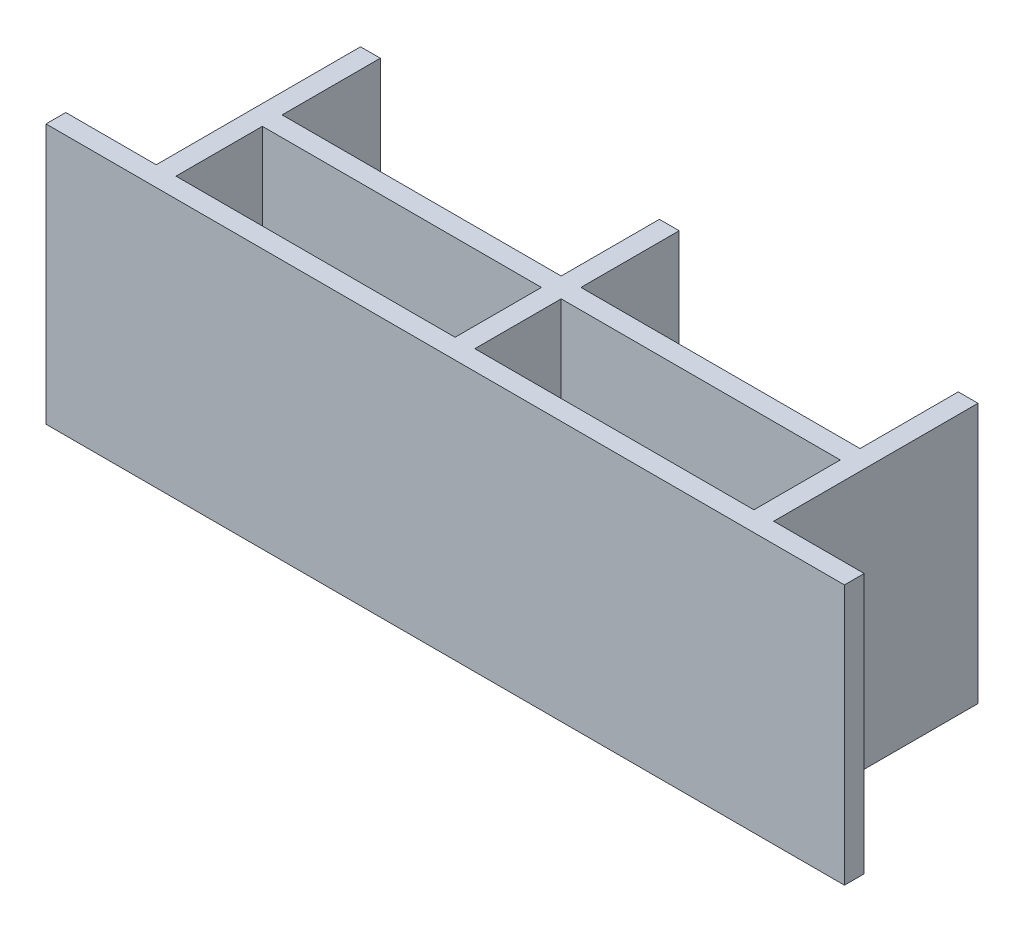
ISO-10303-21;
HEADER;
FILE_DESCRIPTION(('STEP AP214'),'2;1');
FILE_NAME('part.step','',(''),(''),'','','');
FILE_SCHEMA(('AUTOMOTIVE_DESIGN { 1 0 10303 214 1 1 1 1 }'));
ENDSEC;
DATA;
#1=APPLICATION_CONTEXT('core data for automotive mechanical design processes');
#2=APPLICATION_PROTOCOL_DEFINITION('international standard','automotive_design',2000,#1);
#3=PRODUCT_CONTEXT('',#1,'mechanical');
#4=PRODUCT('Part','Part','',(#3));
#5=PRODUCT_RELATED_PRODUCT_CATEGORY('part','',(#4));
#6=PRODUCT_DEFINITION_FORMATION('','',#4);
#7=PRODUCT_DEFINITION_CONTEXT('part definition',#1,'design');
#8=PRODUCT_DEFINITION('design','',#6,#7);
#9=PRODUCT_DEFINITION_SHAPE('','',#8);
#10=(LENGTH_UNIT() NAMED_UNIT(*) SI_UNIT(.MILLI.,.METRE.));
#11=(NAMED_UNIT(*) PLANE_ANGLE_UNIT() SI_UNIT($,.RADIAN.));
#12=(NAMED_UNIT(*) SI_UNIT($,.STERADIAN.) SOLID_ANGLE_UNIT());
#13=UNCERTAINTY_MEASURE_WITH_UNIT(LENGTH_MEASURE(1.E-05),#10,'distance_accuracy_value','');
#14=(GEOMETRIC_REPRESENTATION_CONTEXT(3) GLOBAL_UNCERTAINTY_ASSIGNED_CONTEXT((#13)) GLOBAL_UNIT_ASSIGNED_CONTEXT((#10,
#11,#12)) REPRESENTATION_CONTEXT('',''));
#15=CARTESIAN_POINT('',(0.,0.,0.));
#16=DIRECTION('',(0.,0.,1.));
#17=DIRECTION('',(1.,0.,0.));
#18=AXIS2_PLACEMENT_3D('',#15,#16,#17);
#19=CARTESIAN_POINT('',(0.,32.9,-43.));
#20=DIRECTION('',(0.,0.,1.));
#21=DIRECTION('',(1.,0.,0.));
#22=AXIS2_PLACEMENT_3D('',#19,#20,#21);
#23=PLANE('',#22);
#24=DIRECTION('',(-1.,0.,0.));
#25=VECTOR('',#24,1.);
#26=CARTESIAN_POINT('',(0.,32.9,-43.));
#27=LINE('',#26,#25);
#28=CARTESIAN_POINT('',(51.747,32.9,-43.));
#29=VERTEX_POINT('',#28);
#30=CARTESIAN_POINT('',(49.247,32.9,-43.));
#31=VERTEX_POINT('',#30);
#32=EDGE_CURVE('E42',#29,#31,#27,.T.);
#33=ORIENTED_EDGE('',*,*,#32,.F.);
#34=DIRECTION('',(0.,1.,0.));
#35=VECTOR('',#34,1.);
#36=CARTESIAN_POINT('',(51.747,0.,-43.));
#37=LINE('',#36,#35);
#38=CARTESIAN_POINT('',(51.747,0.,-43.));
#39=VERTEX_POINT('',#38);
#40=EDGE_CURVE('E283',#39,#29,#37,.T.);
#41=ORIENTED_EDGE('',*,*,#40,.F.);
#42=DIRECTION('',(-1.,0.,0.));
#43=VECTOR('',#42,1.);
#44=CARTESIAN_POINT('',(0.,0.,-43.));
#45=LINE('',#44,#43);
#46=CARTESIAN_POINT('',(49.247,0.,-43.));
#47=VERTEX_POINT('',#46);
#48=EDGE_CURVE('E378',#39,#47,#45,.T.);
#49=ORIENTED_EDGE('',*,*,#48,.T.);
#50=DIRECTION('',(0.,1.,0.));
#51=VECTOR('',#50,1.);
#52=CARTESIAN_POINT('',(49.247,0.,-43.));
#53=LINE('',#52,#51);
#54=EDGE_CURVE('E313',#47,#31,#53,.T.);
#55=ORIENTED_EDGE('',*,*,#54,.T.);
#56=EDGE_LOOP('',(#33,#41,#49,#55));
#57=FACE_BOUND('',#56,.T.);
#58=ADVANCED_FACE('F33',(#57),#23,.F.);
#59=CARTESIAN_POINT('',(13.945,32.9,-43.));
#60=VERTEX_POINT('',#59);
#61=CARTESIAN_POINT('',(11.445,32.9,-43.));
#62=VERTEX_POINT('',#61);
#63=EDGE_CURVE('E44',#60,#62,#27,.T.);
#64=ORIENTED_EDGE('',*,*,#63,.F.);
#65=DIRECTION('',(0.,1.,0.));
#66=VECTOR('',#65,1.);
#67=CARTESIAN_POINT('',(13.945,0.,-43.));
#68=LINE('',#67,#66);
#69=CARTESIAN_POINT('',(13.945,0.,-43.));
#70=VERTEX_POINT('',#69);
#71=EDGE_CURVE('E310',#70,#60,#68,.T.);
#72=ORIENTED_EDGE('',*,*,#71,.F.);
#73=CARTESIAN_POINT('',(11.445,0.,-43.));
#74=VERTEX_POINT('',#73);
#75=EDGE_CURVE('E374',#70,#74,#45,.T.);
#76=ORIENTED_EDGE('',*,*,#75,.T.);
#77=DIRECTION('',(0.,1.,0.));
#78=VECTOR('',#77,1.);
#79=CARTESIAN_POINT('',(11.445,0.,-43.));
#80=LINE('',#79,#78);
#81=EDGE_CURVE('E331',#74,#62,#80,.T.);
#82=ORIENTED_EDGE('',*,*,#81,.T.);
#83=EDGE_LOOP('',(#64,#72,#76,#82));
#84=FACE_BOUND('',#83,.T.);
#85=ADVANCED_FACE('F427',(#84),#23,.F.);
#86=CARTESIAN_POINT('',(0.,32.9,0.));
#87=DIRECTION('',(1.,0.,0.));
#88=DIRECTION('',(0.,0.,-1.));
#89=AXIS2_PLACEMENT_3D('',#86,#87,#88);
#90=PLANE('',#89);
#91=DIRECTION('',(0.,0.,1.));
#92=VECTOR('',#91,1.);
#93=CARTESIAN_POINT('',(0.,32.9,0.));
#94=LINE('',#93,#92);
#95=CARTESIAN_POINT('',(0.,32.9,-17.156));
#96=VERTEX_POINT('',#95);
#97=CARTESIAN_POINT('',(0.,32.9,-14.656));
#98=VERTEX_POINT('',#97);
#99=EDGE_CURVE('E367',#96,#98,#94,.T.);
#100=ORIENTED_EDGE('',*,*,#99,.F.);
#101=DIRECTION('',(0.,1.,0.));
#102=VECTOR('',#101,1.);
#103=CARTESIAN_POINT('',(0.,0.,-17.156));
#104=LINE('',#103,#102);
#105=CARTESIAN_POINT('',(0.,0.,-17.156));
#106=VERTEX_POINT('',#105);
#107=EDGE_CURVE('E326',#106,#96,#104,.T.);
#108=ORIENTED_EDGE('',*,*,#107,.F.);
#109=DIRECTION('',(0.,0.,1.));
#110=VECTOR('',#109,1.);
#111=CARTESIAN_POINT('',(0.,0.,0.));
#112=LINE('',#111,#110);
#113=CARTESIAN_POINT('',(0.,0.,-14.656));
#114=VERTEX_POINT('',#113);
#115=EDGE_CURVE('E365',#106,#114,#112,.T.);
#116=ORIENTED_EDGE('',*,*,#115,.T.);
#117=DIRECTION('',(0.,1.,0.));
#118=VECTOR('',#117,1.);
#119=CARTESIAN_POINT('',(0.,0.,-14.656));
#120=LINE('',#119,#118);
#121=EDGE_CURVE('E362',#114,#98,#120,.T.);
#122=ORIENTED_EDGE('',*,*,#121,.T.);
#123=EDGE_LOOP('',(#100,#108,#116,#122));
#124=FACE_BOUND('',#123,.T.);
#125=ADVANCED_FACE('F35',(#124),#90,.F.);
#126=CARTESIAN_POINT('',(101.,32.9,0.));
#127=DIRECTION('',(-1.,0.,0.));
#128=DIRECTION('',(0.,0.,1.));
#129=AXIS2_PLACEMENT_3D('',#126,#127,#128);
#130=PLANE('',#129);
#131=DIRECTION('',(0.,0.,-1.));
#132=VECTOR('',#131,1.);
#133=CARTESIAN_POINT('',(101.,0.,0.));
#134=LINE('',#133,#132);
#135=CARTESIAN_POINT('',(101.,0.,-14.656));
#136=VERTEX_POINT('',#135);
#137=CARTESIAN_POINT('',(101.,0.,-17.156));
#138=VERTEX_POINT('',#137);
#139=EDGE_CURVE('E372',#136,#138,#134,.T.);
#140=ORIENTED_EDGE('',*,*,#139,.T.);
#141=DIRECTION('',(0.,1.,0.));
#142=VECTOR('',#141,1.);
#143=CARTESIAN_POINT('',(101.,0.,-17.156));
#144=LINE('',#143,#142);
#145=CARTESIAN_POINT('',(101.,32.9,-17.156));
#146=VERTEX_POINT('',#145);
#147=EDGE_CURVE('E349',#138,#146,#144,.T.);
#148=ORIENTED_EDGE('',*,*,#147,.T.);
#149=DIRECTION('',(0.,0.,-1.));
#150=VECTOR('',#149,1.);
#151=CARTESIAN_POINT('',(101.,32.9,0.));
#152=LINE('',#151,#150);
#153=CARTESIAN_POINT('',(101.,32.9,-14.656));
#154=VERTEX_POINT('',#153);
#155=EDGE_CURVE('E369',#154,#146,#152,.T.);
#156=ORIENTED_EDGE('',*,*,#155,.F.);
#157=DIRECTION('',(0.,1.,0.));
#158=VECTOR('',#157,1.);
#159=CARTESIAN_POINT('',(101.,0.,-14.656));
#160=LINE('',#159,#158);
#161=EDGE_CURVE('E359',#136,#154,#160,.T.);
#162=ORIENTED_EDGE('',*,*,#161,.F.);
#163=EDGE_LOOP('',(#140,#148,#156,#162));
#164=FACE_BOUND('',#163,.T.);
#165=ADVANCED_FACE('F414',(#164),#130,.F.);
#166=CARTESIAN_POINT('',(89.549,0.,-43.));
#167=VERTEX_POINT('',#166);
#168=CARTESIAN_POINT('',(87.049,0.,-43.));
#169=VERTEX_POINT('',#168);
#170=EDGE_CURVE('E37',#167,#169,#45,.T.);
#171=ORIENTED_EDGE('',*,*,#170,.T.);
#172=DIRECTION('',(0.,1.,0.));
#173=VECTOR('',#172,1.);
#174=CARTESIAN_POINT('',(87.049,0.,-43.));
#175=LINE('',#174,#173);
#176=CARTESIAN_POINT('',(87.049,32.9,-43.));
#177=VERTEX_POINT('',#176);
#178=EDGE_CURVE('E286',#169,#177,#175,.T.);
#179=ORIENTED_EDGE('',*,*,#178,.T.);
#180=CARTESIAN_POINT('',(89.549,32.9,-43.));
#181=VERTEX_POINT('',#180);
#182=EDGE_CURVE('E11',#181,#177,#27,.T.);
#183=ORIENTED_EDGE('',*,*,#182,.F.);
#184=DIRECTION('',(0.,1.,0.));
#185=VECTOR('',#184,1.);
#186=CARTESIAN_POINT('',(89.549,0.,-43.));
#187=LINE('',#186,#185);
#188=EDGE_CURVE('E345',#167,#181,#187,.T.);
#189=ORIENTED_EDGE('',*,*,#188,.F.);
#190=EDGE_LOOP('',(#171,#179,#183,#189));
#191=FACE_BOUND('',#190,.T.);
#192=ADVANCED_FACE('F387',(#191),#23,.F.);
#193=CARTESIAN_POINT('',(0.,32.9,0.));
#194=DIRECTION('',(0.,-1.,0.));
#195=DIRECTION('',(0.,0.,-1.));
#196=AXIS2_PLACEMENT_3D('',#193,#194,#195);
#197=PLANE('',#196);
#198=DIRECTION('',(-1.,0.,0.));
#199=VECTOR('',#198,1.);
#200=CARTESIAN_POINT('',(49.247,32.9,-28.078));
#201=LINE('',#200,#199);
#202=CARTESIAN_POINT('',(49.247,32.9,-28.078));
#203=VERTEX_POINT('',#202);
#204=CARTESIAN_POINT('',(13.945,32.9,-28.078));
#205=VERTEX_POINT('',#204);
#206=EDGE_CURVE('E224',#203,#205,#201,.T.);
#207=ORIENTED_EDGE('',*,*,#206,.F.);
#208=DIRECTION('',(0.,0.,-1.));
#209=VECTOR('',#208,1.);
#210=CARTESIAN_POINT('',(49.247,32.9,-28.078));
#211=LINE('',#210,#209);
#212=CARTESIAN_POINT('',(49.247,32.9,-17.156));
#213=VERTEX_POINT('',#212);
#214=EDGE_CURVE('E51',#213,#203,#211,.T.);
#215=ORIENTED_EDGE('',*,*,#214,.F.);
#216=DIRECTION('',(1.,0.,0.));
#217=VECTOR('',#216,1.);
#218=CARTESIAN_POINT('',(49.247,32.9,-17.156));
#219=LINE('',#218,#217);
#220=CARTESIAN_POINT('',(13.945,32.9,-17.156));
#221=VERTEX_POINT('',#220);
#222=EDGE_CURVE('E215',#221,#213,#219,.T.);
#223=ORIENTED_EDGE('',*,*,#222,.F.);
#224=DIRECTION('',(0.,0.,1.));
#225=VECTOR('',#224,1.);
#226=CARTESIAN_POINT('',(13.945,32.9,-28.078));
#227=LINE('',#226,#225);
#228=EDGE_CURVE('E218',#205,#221,#227,.T.);
#229=ORIENTED_EDGE('',*,*,#228,.F.);
#230=EDGE_LOOP('',(#207,#215,#223,#229));
#231=FACE_BOUND('',#230,.T.);
#232=DIRECTION('',(1.,0.,0.));
#233=VECTOR('',#232,1.);
#234=CARTESIAN_POINT('',(51.747,32.9,-17.156));
#235=LINE('',#234,#233);
#236=CARTESIAN_POINT('',(51.747,32.9,-17.156));
#237=VERTEX_POINT('',#236);
#238=CARTESIAN_POINT('',(87.049,32.9,-17.156));
#239=VERTEX_POINT('',#238);
#240=EDGE_CURVE('E249',#237,#239,#235,.T.);
#241=ORIENTED_EDGE('',*,*,#240,.F.);
#242=DIRECTION('',(0.,0.,1.));
#243=VECTOR('',#242,1.);
#244=CARTESIAN_POINT('',(51.747,32.9,-28.078));
#245=LINE('',#244,#243);
#246=CARTESIAN_POINT('',(51.747,32.9,-28.078));
#247=VERTEX_POINT('',#246);
#248=EDGE_CURVE('E230',#247,#237,#245,.T.);
#249=ORIENTED_EDGE('',*,*,#248,.F.);
#250=DIRECTION('',(-1.,0.,0.));
#251=VECTOR('',#250,1.);
#252=CARTESIAN_POINT('',(51.747,32.9,-28.078));
#253=LINE('',#252,#251);
#254=CARTESIAN_POINT('',(87.049,32.9,-28.078));
#255=VERTEX_POINT('',#254);
#256=EDGE_CURVE('E238',#255,#247,#253,.T.);
#257=ORIENTED_EDGE('',*,*,#256,.F.);
#258=DIRECTION('',(0.,0.,-1.));
#259=VECTOR('',#258,1.);
#260=CARTESIAN_POINT('',(87.049,32.9,-28.078));
#261=LINE('',#260,#259);
#262=EDGE_CURVE('E252',#239,#255,#261,.T.);
#263=ORIENTED_EDGE('',*,*,#262,.F.);
#264=EDGE_LOOP('',(#241,#249,#257,#263));
#265=FACE_BOUND('',#264,.T.);
#266=DIRECTION('',(1.,0.,0.));
#267=VECTOR('',#266,1.);
#268=CARTESIAN_POINT('',(51.747,32.9,-30.578));
#269=LINE('',#268,#267);
#270=CARTESIAN_POINT('',(51.747,32.9,-30.578));
#271=VERTEX_POINT('',#270);
#272=CARTESIAN_POINT('',(87.049,32.9,-30.578));
#273=VERTEX_POINT('',#272);
#274=EDGE_CURVE('E279',#271,#273,#269,.T.);
#275=ORIENTED_EDGE('',*,*,#274,.F.);
#276=DIRECTION('',(0.,0.,1.));
#277=VECTOR('',#276,1.);
#278=CARTESIAN_POINT('',(51.747,32.9,-43.));
#279=LINE('',#278,#277);
#280=EDGE_CURVE('E259',#29,#271,#279,.T.);
#281=ORIENTED_EDGE('',*,*,#280,.F.);
#282=ORIENTED_EDGE('',*,*,#32,.T.);
#283=DIRECTION('',(0.,0.,-1.));
#284=VECTOR('',#283,1.);
#285=CARTESIAN_POINT('',(49.247,32.9,-43.));
#286=LINE('',#285,#284);
#287=CARTESIAN_POINT('',(49.247,32.9,-30.578));
#288=VERTEX_POINT('',#287);
#289=EDGE_CURVE('E296',#288,#31,#286,.T.);
#290=ORIENTED_EDGE('',*,*,#289,.F.);
#291=DIRECTION('',(1.,0.,0.));
#292=VECTOR('',#291,1.);
#293=CARTESIAN_POINT('',(13.945,32.9,-30.578));
#294=LINE('',#293,#292);
#295=CARTESIAN_POINT('',(13.945,32.9,-30.578));
#296=VERTEX_POINT('',#295);
#297=EDGE_CURVE('E305',#296,#288,#294,.T.);
#298=ORIENTED_EDGE('',*,*,#297,.F.);
#299=DIRECTION('',(0.,0.,1.));
#300=VECTOR('',#299,1.);
#301=CARTESIAN_POINT('',(13.945,32.9,-43.));
#302=LINE('',#301,#300);
#303=EDGE_CURVE('E285',#60,#296,#302,.T.);
#304=ORIENTED_EDGE('',*,*,#303,.F.);
#305=ORIENTED_EDGE('',*,*,#63,.T.);
#306=DIRECTION('',(0.,0.,-1.));
#307=VECTOR('',#306,1.);
#308=CARTESIAN_POINT('',(11.445,32.9,-43.));
#309=LINE('',#308,#307);
#310=CARTESIAN_POINT('',(11.445,32.9,-17.156));
#311=VERTEX_POINT('',#310);
#312=EDGE_CURVE('E323',#311,#62,#309,.T.);
#313=ORIENTED_EDGE('',*,*,#312,.F.);
#314=DIRECTION('',(1.,0.,0.));
#315=VECTOR('',#314,1.);
#316=CARTESIAN_POINT('',(0.,32.9,-17.156));
#317=LINE('',#316,#315);
#318=EDGE_CURVE('E312',#96,#311,#317,.T.);
#319=ORIENTED_EDGE('',*,*,#318,.F.);
#320=ORIENTED_EDGE('',*,*,#99,.T.);
#321=DIRECTION('',(-1.,0.,0.));
#322=VECTOR('',#321,1.);
#323=CARTESIAN_POINT('',(0.,32.9,-14.656));
#324=LINE('',#323,#322);
#325=EDGE_CURVE('E352',#154,#98,#324,.T.);
#326=ORIENTED_EDGE('',*,*,#325,.F.);
#327=ORIENTED_EDGE('',*,*,#155,.T.);
#328=DIRECTION('',(1.,0.,0.));
#329=VECTOR('',#328,1.);
#330=CARTESIAN_POINT('',(101.,32.9,-17.156));
#331=LINE('',#330,#329);
#332=CARTESIAN_POINT('',(89.549,32.9,-17.156));
#333=VERTEX_POINT('',#332);
#334=EDGE_CURVE('E342',#333,#146,#331,.T.);
#335=ORIENTED_EDGE('',*,*,#334,.F.);
#336=DIRECTION('',(0.,0.,1.));
#337=VECTOR('',#336,1.);
#338=CARTESIAN_POINT('',(89.549,32.9,-43.));
#339=LINE('',#338,#337);
#340=EDGE_CURVE('E334',#181,#333,#339,.T.);
#341=ORIENTED_EDGE('',*,*,#340,.F.);
#342=ORIENTED_EDGE('',*,*,#182,.T.);
#343=DIRECTION('',(0.,0.,-1.));
#344=VECTOR('',#343,1.);
#345=CARTESIAN_POINT('',(87.049,32.9,-43.));
#346=LINE('',#345,#344);
#347=EDGE_CURVE('E270',#273,#177,#346,.T.);
#348=ORIENTED_EDGE('',*,*,#347,.F.);
#349=EDGE_LOOP('',(#275,#281,#282,#290,#298,#304,#305,#313,#319,#320,#326,#327,#335,#341,#342,#348));
#350=FACE_BOUND('',#349,.T.);
#351=ADVANCED_FACE('F400',(#231,#265,#350),#197,.F.);
#352=CARTESIAN_POINT('',(0.,0.,0.));
#353=DIRECTION('',(0.,-1.,0.));
#354=DIRECTION('',(0.,0.,-1.));
#355=AXIS2_PLACEMENT_3D('',#352,#353,#354);
#356=PLANE('',#355);
#357=DIRECTION('',(0.,0.,-1.));
#358=VECTOR('',#357,1.);
#359=CARTESIAN_POINT('',(49.247,0.,-28.078));
#360=LINE('',#359,#358);
#361=CARTESIAN_POINT('',(49.247,0.,-17.156));
#362=VERTEX_POINT('',#361);
#363=CARTESIAN_POINT('',(49.247,0.,-28.078));
#364=VERTEX_POINT('',#363);
#365=EDGE_CURVE('E199',#362,#364,#360,.T.);
#366=ORIENTED_EDGE('',*,*,#365,.T.);
#367=DIRECTION('',(-1.,0.,0.));
#368=VECTOR('',#367,1.);
#369=CARTESIAN_POINT('',(49.247,0.,-28.078));
#370=LINE('',#369,#368);
#371=CARTESIAN_POINT('',(13.945,0.,-28.078));
#372=VERTEX_POINT('',#371);
#373=EDGE_CURVE('E208',#364,#372,#370,.T.);
#374=ORIENTED_EDGE('',*,*,#373,.T.);
#375=DIRECTION('',(0.,0.,1.));
#376=VECTOR('',#375,1.);
#377=CARTESIAN_POINT('',(13.945,0.,-28.078));
#378=LINE('',#377,#376);
#379=CARTESIAN_POINT('',(13.945,0.,-17.156));
#380=VERTEX_POINT('',#379);
#381=EDGE_CURVE('E59',#372,#380,#378,.T.);
#382=ORIENTED_EDGE('',*,*,#381,.T.);
#383=DIRECTION('',(1.,0.,0.));
#384=VECTOR('',#383,1.);
#385=CARTESIAN_POINT('',(49.247,0.,-17.156));
#386=LINE('',#385,#384);
#387=EDGE_CURVE('E205',#380,#362,#386,.T.);
#388=ORIENTED_EDGE('',*,*,#387,.T.);
#389=EDGE_LOOP('',(#366,#374,#382,#388));
#390=FACE_BOUND('',#389,.T.);
#391=DIRECTION('',(0.,0.,1.));
#392=VECTOR('',#391,1.);
#393=CARTESIAN_POINT('',(51.747,0.,-28.078));
#394=LINE('',#393,#392);
#395=CARTESIAN_POINT('',(51.747,0.,-28.078));
#396=VERTEX_POINT('',#395);
#397=CARTESIAN_POINT('',(51.747,0.,-17.156));
#398=VERTEX_POINT('',#397);
#399=EDGE_CURVE('E234',#396,#398,#394,.T.);
#400=ORIENTED_EDGE('',*,*,#399,.T.);
#401=DIRECTION('',(1.,0.,0.));
#402=VECTOR('',#401,1.);
#403=CARTESIAN_POINT('',(51.747,0.,-17.156));
#404=LINE('',#403,#402);
#405=CARTESIAN_POINT('',(87.049,0.,-17.156));
#406=VERTEX_POINT('',#405);
#407=EDGE_CURVE('E237',#398,#406,#404,.T.);
#408=ORIENTED_EDGE('',*,*,#407,.T.);
#409=DIRECTION('',(0.,0.,-1.));
#410=VECTOR('',#409,1.);
#411=CARTESIAN_POINT('',(87.049,0.,-28.078));
#412=LINE('',#411,#410);
#413=CARTESIAN_POINT('',(87.049,0.,-28.078));
#414=VERTEX_POINT('',#413);
#415=EDGE_CURVE('E241',#406,#414,#412,.T.);
#416=ORIENTED_EDGE('',*,*,#415,.T.);
#417=DIRECTION('',(-1.,0.,0.));
#418=VECTOR('',#417,1.);
#419=CARTESIAN_POINT('',(51.747,0.,-28.078));
#420=LINE('',#419,#418);
#421=EDGE_CURVE('E244',#414,#396,#420,.T.);
#422=ORIENTED_EDGE('',*,*,#421,.T.);
#423=EDGE_LOOP('',(#400,#408,#416,#422));
#424=FACE_BOUND('',#423,.T.);
#425=DIRECTION('',(0.,0.,1.));
#426=VECTOR('',#425,1.);
#427=CARTESIAN_POINT('',(51.747,0.,-43.));
#428=LINE('',#427,#426);
#429=CARTESIAN_POINT('',(51.747,0.,-30.578));
#430=VERTEX_POINT('',#429);
#431=EDGE_CURVE('E266',#39,#430,#428,.T.);
#432=ORIENTED_EDGE('',*,*,#431,.T.);
#433=DIRECTION('',(1.,0.,0.));
#434=VECTOR('',#433,1.);
#435=CARTESIAN_POINT('',(51.747,0.,-30.578));
#436=LINE('',#435,#434);
#437=CARTESIAN_POINT('',(87.049,0.,-30.578));
#438=VERTEX_POINT('',#437);
#439=EDGE_CURVE('E269',#430,#438,#436,.T.);
#440=ORIENTED_EDGE('',*,*,#439,.T.);
#441=DIRECTION('',(0.,0.,-1.));
#442=VECTOR('',#441,1.);
#443=CARTESIAN_POINT('',(87.049,0.,-43.));
#444=LINE('',#443,#442);
#445=EDGE_CURVE('E273',#438,#169,#444,.T.);
#446=ORIENTED_EDGE('',*,*,#445,.T.);
#447=ORIENTED_EDGE('',*,*,#170,.F.);
#448=DIRECTION('',(0.,0.,1.));
#449=VECTOR('',#448,1.);
#450=CARTESIAN_POINT('',(89.549,0.,-43.));
#451=LINE('',#450,#449);
#452=CARTESIAN_POINT('',(89.549,0.,-17.156));
#453=VERTEX_POINT('',#452);
#454=EDGE_CURVE('E338',#167,#453,#451,.T.);
#455=ORIENTED_EDGE('',*,*,#454,.T.);
#456=DIRECTION('',(1.,0.,0.));
#457=VECTOR('',#456,1.);
#458=CARTESIAN_POINT('',(101.,0.,-17.156));
#459=LINE('',#458,#457);
#460=EDGE_CURVE('E341',#453,#138,#459,.T.);
#461=ORIENTED_EDGE('',*,*,#460,.T.);
#462=ORIENTED_EDGE('',*,*,#139,.F.);
#463=DIRECTION('',(-1.,0.,0.));
#464=VECTOR('',#463,1.);
#465=CARTESIAN_POINT('',(0.,0.,-14.656));
#466=LINE('',#465,#464);
#467=EDGE_CURVE('E356',#136,#114,#466,.T.);
#468=ORIENTED_EDGE('',*,*,#467,.T.);
#469=ORIENTED_EDGE('',*,*,#115,.F.);
#470=DIRECTION('',(1.,0.,0.));
#471=VECTOR('',#470,1.);
#472=CARTESIAN_POINT('',(0.,0.,-17.156));
#473=LINE('',#472,#471);
#474=CARTESIAN_POINT('',(11.445,0.,-17.156));
#475=VERTEX_POINT('',#474);
#476=EDGE_CURVE('E319',#106,#475,#473,.T.);
#477=ORIENTED_EDGE('',*,*,#476,.T.);
#478=DIRECTION('',(0.,0.,-1.));
#479=VECTOR('',#478,1.);
#480=CARTESIAN_POINT('',(11.445,0.,-43.));
#481=LINE('',#480,#479);
#482=EDGE_CURVE('E322',#475,#74,#481,.T.);
#483=ORIENTED_EDGE('',*,*,#482,.T.);
#484=ORIENTED_EDGE('',*,*,#75,.F.);
#485=DIRECTION('',(0.,0.,1.));
#486=VECTOR('',#485,1.);
#487=CARTESIAN_POINT('',(13.945,0.,-43.));
#488=LINE('',#487,#486);
#489=CARTESIAN_POINT('',(13.945,0.,-30.578));
#490=VERTEX_POINT('',#489);
#491=EDGE_CURVE('E292',#70,#490,#488,.T.);
#492=ORIENTED_EDGE('',*,*,#491,.T.);
#493=DIRECTION('',(1.,0.,0.));
#494=VECTOR('',#493,1.);
#495=CARTESIAN_POINT('',(13.945,0.,-30.578));
#496=LINE('',#495,#494);
#497=CARTESIAN_POINT('',(49.247,0.,-30.578));
#498=VERTEX_POINT('',#497);
#499=EDGE_CURVE('E295',#490,#498,#496,.T.);
#500=ORIENTED_EDGE('',*,*,#499,.T.);
#501=DIRECTION('',(0.,0.,-1.));
#502=VECTOR('',#501,1.);
#503=CARTESIAN_POINT('',(49.247,0.,-43.));
#504=LINE('',#503,#502);
#505=EDGE_CURVE('E299',#498,#47,#504,.T.);
#506=ORIENTED_EDGE('',*,*,#505,.T.);
#507=ORIENTED_EDGE('',*,*,#48,.F.);
#508=EDGE_LOOP('',(#432,#440,#446,#447,#455,#461,#462,#468,#469,#477,#483,#484,#492,#500,#506,#507));
#509=FACE_BOUND('',#508,.T.);
#510=ADVANCED_FACE('F212',(#390,#424,#509),#356,.T.);
#511=CARTESIAN_POINT('',(0.,0.,-14.656));
#512=DIRECTION('',(0.,0.,-1.));
#513=DIRECTION('',(-1.,0.,0.));
#514=AXIS2_PLACEMENT_3D('',#511,#512,#513);
#515=PLANE('',#514);
#516=ORIENTED_EDGE('',*,*,#325,.T.);
#517=ORIENTED_EDGE('',*,*,#121,.F.);
#518=ORIENTED_EDGE('',*,*,#467,.F.);
#519=ORIENTED_EDGE('',*,*,#161,.T.);
#520=EDGE_LOOP('',(#516,#517,#518,#519));
#521=FACE_BOUND('',#520,.T.);
#522=ADVANCED_FACE('F411',(#521),#515,.F.);
#523=CARTESIAN_POINT('',(101.,0.,-17.156));
#524=DIRECTION('',(0.,0.,1.));
#525=DIRECTION('',(1.,0.,0.));
#526=AXIS2_PLACEMENT_3D('',#523,#524,#525);
#527=PLANE('',#526);
#528=ORIENTED_EDGE('',*,*,#334,.T.);
#529=ORIENTED_EDGE('',*,*,#147,.F.);
#530=ORIENTED_EDGE('',*,*,#460,.F.);
#531=DIRECTION('',(0.,1.,0.));
#532=VECTOR('',#531,1.);
#533=CARTESIAN_POINT('',(89.549,0.,-17.156));
#534=LINE('',#533,#532);
#535=EDGE_CURVE('E353',#453,#333,#534,.T.);
#536=ORIENTED_EDGE('',*,*,#535,.T.);
#537=EDGE_LOOP('',(#528,#529,#530,#536));
#538=FACE_BOUND('',#537,.T.);
#539=ADVANCED_FACE('F407',(#538),#527,.F.);
#540=CARTESIAN_POINT('',(89.549,0.,-43.));
#541=DIRECTION('',(-1.,0.,0.));
#542=DIRECTION('',(0.,0.,1.));
#543=AXIS2_PLACEMENT_3D('',#540,#541,#542);
#544=PLANE('',#543);
#545=ORIENTED_EDGE('',*,*,#340,.T.);
#546=ORIENTED_EDGE('',*,*,#535,.F.);
#547=ORIENTED_EDGE('',*,*,#454,.F.);
#548=ORIENTED_EDGE('',*,*,#188,.T.);
#549=EDGE_LOOP('',(#545,#546,#547,#548));
#550=FACE_BOUND('',#549,.T.);
#551=ADVANCED_FACE('F405',(#550),#544,.F.);
#552=CARTESIAN_POINT('',(11.445,0.,-43.));
#553=DIRECTION('',(1.,0.,0.));
#554=DIRECTION('',(0.,0.,-1.));
#555=AXIS2_PLACEMENT_3D('',#552,#553,#554);
#556=PLANE('',#555);
#557=ORIENTED_EDGE('',*,*,#312,.T.);
#558=ORIENTED_EDGE('',*,*,#81,.F.);
#559=ORIENTED_EDGE('',*,*,#482,.F.);
#560=DIRECTION('',(0.,1.,0.));
#561=VECTOR('',#560,1.);
#562=CARTESIAN_POINT('',(11.445,0.,-17.156));
#563=LINE('',#562,#561);
#564=EDGE_CURVE('E335',#475,#311,#563,.T.);
#565=ORIENTED_EDGE('',*,*,#564,.T.);
#566=EDGE_LOOP('',(#557,#558,#559,#565));
#567=FACE_BOUND('',#566,.T.);
#568=ADVANCED_FACE('F426',(#567),#556,.F.);
#569=CARTESIAN_POINT('',(0.,0.,-17.156));
#570=DIRECTION('',(0.,0.,1.));
#571=DIRECTION('',(1.,0.,0.));
#572=AXIS2_PLACEMENT_3D('',#569,#570,#571);
#573=PLANE('',#572);
#574=ORIENTED_EDGE('',*,*,#318,.T.);
#575=ORIENTED_EDGE('',*,*,#564,.F.);
#576=ORIENTED_EDGE('',*,*,#476,.F.);
#577=ORIENTED_EDGE('',*,*,#107,.T.);
#578=EDGE_LOOP('',(#574,#575,#576,#577));
#579=FACE_BOUND('',#578,.T.);
#580=ADVANCED_FACE('F420',(#579),#573,.F.);
#581=CARTESIAN_POINT('',(13.945,0.,-43.));
#582=DIRECTION('',(-1.,0.,0.));
#583=DIRECTION('',(0.,0.,1.));
#584=AXIS2_PLACEMENT_3D('',#581,#582,#583);
#585=PLANE('',#584);
#586=ORIENTED_EDGE('',*,*,#303,.T.);
#587=DIRECTION('',(0.,1.,0.));
#588=VECTOR('',#587,1.);
#589=CARTESIAN_POINT('',(13.945,0.,-30.578));
#590=LINE('',#589,#588);
#591=EDGE_CURVE('E302',#490,#296,#590,.T.);
#592=ORIENTED_EDGE('',*,*,#591,.F.);
#593=ORIENTED_EDGE('',*,*,#491,.F.);
#594=ORIENTED_EDGE('',*,*,#71,.T.);
#595=EDGE_LOOP('',(#586,#592,#593,#594));
#596=FACE_BOUND('',#595,.T.);
#597=ADVANCED_FACE('F442',(#596),#585,.F.);
#598=CARTESIAN_POINT('',(49.247,0.,-43.));
#599=DIRECTION('',(1.,0.,0.));
#600=DIRECTION('',(0.,0.,-1.));
#601=AXIS2_PLACEMENT_3D('',#598,#599,#600);
#602=PLANE('',#601);
#603=ORIENTED_EDGE('',*,*,#289,.T.);
#604=ORIENTED_EDGE('',*,*,#54,.F.);
#605=ORIENTED_EDGE('',*,*,#505,.F.);
#606=DIRECTION('',(0.,1.,0.));
#607=VECTOR('',#606,1.);
#608=CARTESIAN_POINT('',(49.247,0.,-30.578));
#609=LINE('',#608,#607);
#610=EDGE_CURVE('E316',#498,#288,#609,.T.);
#611=ORIENTED_EDGE('',*,*,#610,.T.);
#612=EDGE_LOOP('',(#603,#604,#605,#611));
#613=FACE_BOUND('',#612,.T.);
#614=ADVANCED_FACE('F435',(#613),#602,.F.);
#615=CARTESIAN_POINT('',(13.945,0.,-30.578));
#616=DIRECTION('',(0.,0.,1.));
#617=DIRECTION('',(1.,0.,0.));
#618=AXIS2_PLACEMENT_3D('',#615,#616,#617);
#619=PLANE('',#618);
#620=ORIENTED_EDGE('',*,*,#297,.T.);
#621=ORIENTED_EDGE('',*,*,#610,.F.);
#622=ORIENTED_EDGE('',*,*,#499,.F.);
#623=ORIENTED_EDGE('',*,*,#591,.T.);
#624=EDGE_LOOP('',(#620,#621,#622,#623));
#625=FACE_BOUND('',#624,.T.);
#626=ADVANCED_FACE('F440',(#625),#619,.F.);
#627=CARTESIAN_POINT('',(51.747,0.,-43.));
#628=DIRECTION('',(-1.,0.,0.));
#629=DIRECTION('',(0.,0.,1.));
#630=AXIS2_PLACEMENT_3D('',#627,#628,#629);
#631=PLANE('',#630);
#632=ORIENTED_EDGE('',*,*,#280,.T.);
#633=DIRECTION('',(0.,1.,0.));
#634=VECTOR('',#633,1.);
#635=CARTESIAN_POINT('',(51.747,0.,-30.578));
#636=LINE('',#635,#634);
#637=EDGE_CURVE('E276',#430,#271,#636,.T.);
#638=ORIENTED_EDGE('',*,*,#637,.F.);
#639=ORIENTED_EDGE('',*,*,#431,.F.);
#640=ORIENTED_EDGE('',*,*,#40,.T.);
#641=EDGE_LOOP('',(#632,#638,#639,#640));
#642=FACE_BOUND('',#641,.T.);
#643=ADVANCED_FACE('F532',(#642),#631,.F.);
#644=CARTESIAN_POINT('',(87.049,0.,-43.));
#645=DIRECTION('',(1.,0.,0.));
#646=DIRECTION('',(0.,0.,-1.));
#647=AXIS2_PLACEMENT_3D('',#644,#645,#646);
#648=PLANE('',#647);
#649=ORIENTED_EDGE('',*,*,#347,.T.);
#650=ORIENTED_EDGE('',*,*,#178,.F.);
#651=ORIENTED_EDGE('',*,*,#445,.F.);
#652=DIRECTION('',(0.,1.,0.));
#653=VECTOR('',#652,1.);
#654=CARTESIAN_POINT('',(87.049,0.,-30.578));
#655=LINE('',#654,#653);
#656=EDGE_CURVE('E289',#438,#273,#655,.T.);
#657=ORIENTED_EDGE('',*,*,#656,.T.);
#658=EDGE_LOOP('',(#649,#650,#651,#657));
#659=FACE_BOUND('',#658,.T.);
#660=ADVANCED_FACE('F393',(#659),#648,.F.);
#661=CARTESIAN_POINT('',(51.747,0.,-30.578));
#662=DIRECTION('',(0.,0.,1.));
#663=DIRECTION('',(1.,0.,0.));
#664=AXIS2_PLACEMENT_3D('',#661,#662,#663);
#665=PLANE('',#664);
#666=ORIENTED_EDGE('',*,*,#274,.T.);
#667=ORIENTED_EDGE('',*,*,#656,.F.);
#668=ORIENTED_EDGE('',*,*,#439,.F.);
#669=ORIENTED_EDGE('',*,*,#637,.T.);
#670=EDGE_LOOP('',(#666,#667,#668,#669));
#671=FACE_BOUND('',#670,.T.);
#672=ADVANCED_FACE('F395',(#671),#665,.F.);
#673=CARTESIAN_POINT('',(51.747,0.,-28.078));
#674=DIRECTION('',(-1.,0.,0.));
#675=DIRECTION('',(0.,0.,1.));
#676=AXIS2_PLACEMENT_3D('',#673,#674,#675);
#677=PLANE('',#676);
#678=ORIENTED_EDGE('',*,*,#248,.T.);
#679=DIRECTION('',(0.,1.,0.));
#680=VECTOR('',#679,1.);
#681=CARTESIAN_POINT('',(51.747,0.,-17.156));
#682=LINE('',#681,#680);
#683=EDGE_CURVE('E247',#398,#237,#682,.T.);
#684=ORIENTED_EDGE('',*,*,#683,.F.);
#685=ORIENTED_EDGE('',*,*,#399,.F.);
#686=DIRECTION('',(0.,1.,0.));
#687=VECTOR('',#686,1.);
#688=CARTESIAN_POINT('',(51.747,0.,-28.078));
#689=LINE('',#688,#687);
#690=EDGE_CURVE('E257',#396,#247,#689,.T.);
#691=ORIENTED_EDGE('',*,*,#690,.T.);
#692=EDGE_LOOP('',(#678,#684,#685,#691));
#693=FACE_BOUND('',#692,.T.);
#694=ADVANCED_FACE('F554',(#693),#677,.F.);
#695=CARTESIAN_POINT('',(51.747,0.,-28.078));
#696=DIRECTION('',(0.,0.,-1.));
#697=DIRECTION('',(-1.,0.,0.));
#698=AXIS2_PLACEMENT_3D('',#695,#696,#697);
#699=PLANE('',#698);
#700=ORIENTED_EDGE('',*,*,#256,.T.);
#701=ORIENTED_EDGE('',*,*,#690,.F.);
#702=ORIENTED_EDGE('',*,*,#421,.F.);
#703=DIRECTION('',(0.,1.,0.));
#704=VECTOR('',#703,1.);
#705=CARTESIAN_POINT('',(87.049,0.,-28.078));
#706=LINE('',#705,#704);
#707=EDGE_CURVE('E260',#414,#255,#706,.T.);
#708=ORIENTED_EDGE('',*,*,#707,.T.);
#709=EDGE_LOOP('',(#700,#701,#702,#708));
#710=FACE_BOUND('',#709,.T.);
#711=ADVANCED_FACE('F562',(#710),#699,.F.);
#712=CARTESIAN_POINT('',(87.049,0.,-28.078));
#713=DIRECTION('',(1.,0.,0.));
#714=DIRECTION('',(0.,0.,-1.));
#715=AXIS2_PLACEMENT_3D('',#712,#713,#714);
#716=PLANE('',#715);
#717=ORIENTED_EDGE('',*,*,#262,.T.);
#718=ORIENTED_EDGE('',*,*,#707,.F.);
#719=ORIENTED_EDGE('',*,*,#415,.F.);
#720=DIRECTION('',(0.,1.,0.));
#721=VECTOR('',#720,1.);
#722=CARTESIAN_POINT('',(87.049,0.,-17.156));
#723=LINE('',#722,#721);
#724=EDGE_CURVE('E262',#406,#239,#723,.T.);
#725=ORIENTED_EDGE('',*,*,#724,.T.);
#726=EDGE_LOOP('',(#717,#718,#719,#725));
#727=FACE_BOUND('',#726,.T.);
#728=ADVANCED_FACE('F571',(#727),#716,.F.);
#729=CARTESIAN_POINT('',(51.747,0.,-17.156));
#730=DIRECTION('',(0.,0.,1.));
#731=DIRECTION('',(1.,0.,0.));
#732=AXIS2_PLACEMENT_3D('',#729,#730,#731);
#733=PLANE('',#732);
#734=ORIENTED_EDGE('',*,*,#240,.T.);
#735=ORIENTED_EDGE('',*,*,#724,.F.);
#736=ORIENTED_EDGE('',*,*,#407,.F.);
#737=ORIENTED_EDGE('',*,*,#683,.T.);
#738=EDGE_LOOP('',(#734,#735,#736,#737));
#739=FACE_BOUND('',#738,.T.);
#740=ADVANCED_FACE('F580',(#739),#733,.F.);
#741=CARTESIAN_POINT('',(49.247,0.,-28.078));
#742=DIRECTION('',(1.,0.,0.));
#743=DIRECTION('',(0.,0.,-1.));
#744=AXIS2_PLACEMENT_3D('',#741,#742,#743);
#745=PLANE('',#744);
#746=ORIENTED_EDGE('',*,*,#214,.T.);
#747=DIRECTION('',(0.,1.,0.));
#748=VECTOR('',#747,1.);
#749=CARTESIAN_POINT('',(49.247,0.,-28.078));
#750=LINE('',#749,#748);
#751=EDGE_CURVE('E195',#364,#203,#750,.T.);
#752=ORIENTED_EDGE('',*,*,#751,.F.);
#753=ORIENTED_EDGE('',*,*,#365,.F.);
#754=DIRECTION('',(0.,1.,0.));
#755=VECTOR('',#754,1.);
#756=CARTESIAN_POINT('',(49.247,0.,-17.156));
#757=LINE('',#756,#755);
#758=EDGE_CURVE('E228',#362,#213,#757,.T.);
#759=ORIENTED_EDGE('',*,*,#758,.T.);
#760=EDGE_LOOP('',(#746,#752,#753,#759));
#761=FACE_BOUND('',#760,.T.);
#762=ADVANCED_FACE('F197',(#761),#745,.F.);
#763=CARTESIAN_POINT('',(49.247,0.,-17.156));
#764=DIRECTION('',(0.,0.,1.));
#765=DIRECTION('',(1.,0.,0.));
#766=AXIS2_PLACEMENT_3D('',#763,#764,#765);
#767=PLANE('',#766);
#768=ORIENTED_EDGE('',*,*,#222,.T.);
#769=ORIENTED_EDGE('',*,*,#758,.F.);
#770=ORIENTED_EDGE('',*,*,#387,.F.);
#771=DIRECTION('',(0.,1.,0.));
#772=VECTOR('',#771,1.);
#773=CARTESIAN_POINT('',(13.945,0.,-17.156));
#774=LINE('',#773,#772);
#775=EDGE_CURVE('E231',#380,#221,#774,.T.);
#776=ORIENTED_EDGE('',*,*,#775,.T.);
#777=EDGE_LOOP('',(#768,#769,#770,#776));
#778=FACE_BOUND('',#777,.T.);
#779=ADVANCED_FACE('F597',(#778),#767,.F.);
#780=CARTESIAN_POINT('',(13.945,0.,-28.078));
#781=DIRECTION('',(-1.,0.,0.));
#782=DIRECTION('',(0.,0.,1.));
#783=AXIS2_PLACEMENT_3D('',#780,#781,#782);
#784=PLANE('',#783);
#785=ORIENTED_EDGE('',*,*,#228,.T.);
#786=ORIENTED_EDGE('',*,*,#775,.F.);
#787=ORIENTED_EDGE('',*,*,#381,.F.);
#788=DIRECTION('',(0.,1.,0.));
#789=VECTOR('',#788,1.);
#790=CARTESIAN_POINT('',(13.945,0.,-28.078));
#791=LINE('',#790,#789);
#792=EDGE_CURVE('E204',#372,#205,#791,.T.);
#793=ORIENTED_EDGE('',*,*,#792,.T.);
#794=EDGE_LOOP('',(#785,#786,#787,#793));
#795=FACE_BOUND('',#794,.T.);
#796=ADVANCED_FACE('F605',(#795),#784,.F.);
#797=CARTESIAN_POINT('',(49.247,0.,-28.078));
#798=DIRECTION('',(0.,0.,-1.));
#799=DIRECTION('',(-1.,0.,0.));
#800=AXIS2_PLACEMENT_3D('',#797,#798,#799);
#801=PLANE('',#800);
#802=ORIENTED_EDGE('',*,*,#206,.T.);
#803=ORIENTED_EDGE('',*,*,#792,.F.);
#804=ORIENTED_EDGE('',*,*,#373,.F.);
#805=ORIENTED_EDGE('',*,*,#751,.T.);
#806=EDGE_LOOP('',(#802,#803,#804,#805));
#807=FACE_BOUND('',#806,.T.);
#808=ADVANCED_FACE('F209',(#807),#801,.F.);
#809=CLOSED_SHELL('',(#58,#85,#125,#165,#192,#351,#510,#522,#539,#551,#568,#580,#597,#614,#626,
#643,#660,#672,#694,#711,#728,#740,#762,#779,#796,#808));
#810=MANIFOLD_SOLID_BREP('B2',#809);
#811=ADVANCED_BREP_SHAPE_REPRESENTATION('',(#18,#810),#14);
#812=SHAPE_DEFINITION_REPRESENTATION(#9,#811);
ENDSEC;
END-ISO-10303-21;
